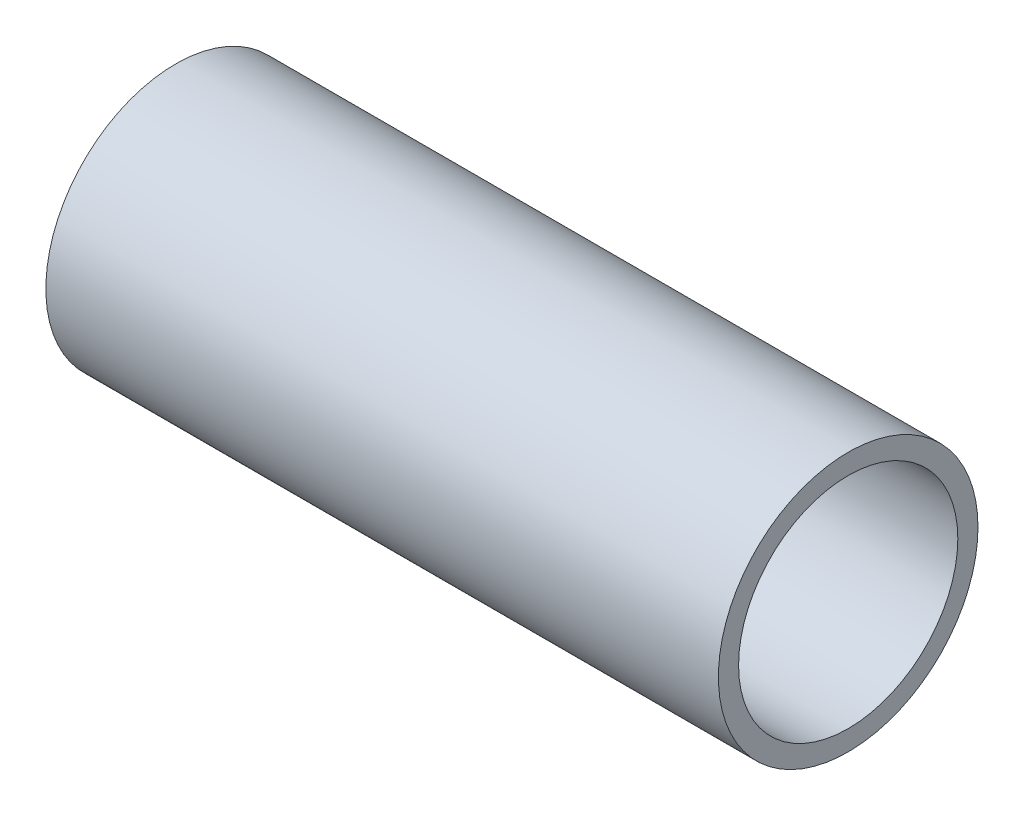
ISO-10303-21;
HEADER;
FILE_DESCRIPTION(('STEP AP214'),'2;1');
FILE_NAME('part.step','',(''),(''),'','','');
FILE_SCHEMA(('AUTOMOTIVE_DESIGN { 1 0 10303 214 1 1 1 1 }'));
ENDSEC;
DATA;
#1=APPLICATION_CONTEXT('core data for automotive mechanical design processes');
#2=APPLICATION_PROTOCOL_DEFINITION('international standard','automotive_design',2000,#1);
#3=PRODUCT_CONTEXT('',#1,'mechanical');
#4=PRODUCT('Part','Part','',(#3));
#5=PRODUCT_RELATED_PRODUCT_CATEGORY('part','',(#4));
#6=PRODUCT_DEFINITION_FORMATION('','',#4);
#7=PRODUCT_DEFINITION_CONTEXT('part definition',#1,'design');
#8=PRODUCT_DEFINITION('design','',#6,#7);
#9=PRODUCT_DEFINITION_SHAPE('','',#8);
#10=(LENGTH_UNIT() NAMED_UNIT(*) SI_UNIT(.MILLI.,.METRE.));
#11=(NAMED_UNIT(*) PLANE_ANGLE_UNIT() SI_UNIT($,.RADIAN.));
#12=(NAMED_UNIT(*) SI_UNIT($,.STERADIAN.) SOLID_ANGLE_UNIT());
#13=UNCERTAINTY_MEASURE_WITH_UNIT(LENGTH_MEASURE(1.E-05),#10,'distance_accuracy_value','');
#14=(GEOMETRIC_REPRESENTATION_CONTEXT(3) GLOBAL_UNCERTAINTY_ASSIGNED_CONTEXT((#13)) GLOBAL_UNIT_ASSIGNED_CONTEXT((#10,
#11,#12)) REPRESENTATION_CONTEXT('',''));
#15=CARTESIAN_POINT('',(0.,0.,0.));
#16=DIRECTION('',(0.,0.,1.));
#17=DIRECTION('',(1.,0.,0.));
#18=AXIS2_PLACEMENT_3D('',#15,#16,#17);
#19=CARTESIAN_POINT('',(-50.,0.,0.));
#20=DIRECTION('',(1.,0.,0.));
#21=DIRECTION('',(0.,0.,-1.));
#22=AXIS2_PLACEMENT_3D('',#19,#20,#21);
#23=CYLINDRICAL_SURFACE('',#22,9.65);
#24=CARTESIAN_POINT('',(-50.,0.,0.));
#25=DIRECTION('',(1.,0.,0.));
#26=DIRECTION('',(0.,0.,-1.));
#27=AXIS2_PLACEMENT_3D('',#24,#25,#26);
#28=CIRCLE('',#27,9.65);
#29=CARTESIAN_POINT('',(-50.,0.,-9.65));
#30=VERTEX_POINT('',#29);
#31=EDGE_CURVE('E10',#30,#30,#28,.T.);
#32=ORIENTED_EDGE('',*,*,#31,.T.);
#33=EDGE_LOOP('',(#32));
#34=FACE_BOUND('',#33,.T.);
#35=CARTESIAN_POINT('',(0.,0.,0.));
#36=DIRECTION('',(1.,0.,0.));
#37=DIRECTION('',(0.,0.,-1.));
#38=AXIS2_PLACEMENT_3D('',#35,#36,#37);
#39=CIRCLE('',#38,9.65);
#40=CARTESIAN_POINT('',(0.,0.,-9.65));
#41=VERTEX_POINT('',#40);
#42=EDGE_CURVE('E38',#41,#41,#39,.T.);
#43=ORIENTED_EDGE('',*,*,#42,.F.);
#44=EDGE_LOOP('',(#43));
#45=FACE_BOUND('',#44,.T.);
#46=ADVANCED_FACE('F35',(#34,#45),#23,.T.);
#47=CARTESIAN_POINT('',(-50.,0.,0.));
#48=DIRECTION('',(1.,0.,0.));
#49=DIRECTION('',(0.,0.,-1.));
#50=AXIS2_PLACEMENT_3D('',#47,#48,#49);
#51=PLANE('',#50);
#52=CARTESIAN_POINT('',(-50.,0.,0.));
#53=DIRECTION('',(1.,0.,0.));
#54=DIRECTION('',(0.,0.,-1.));
#55=AXIS2_PLACEMENT_3D('',#52,#53,#54);
#56=CIRCLE('',#55,8.15);
#57=CARTESIAN_POINT('',(-50.,0.,-8.15));
#58=VERTEX_POINT('',#57);
#59=EDGE_CURVE('E45',#58,#58,#56,.T.);
#60=ORIENTED_EDGE('',*,*,#59,.T.);
#61=EDGE_LOOP('',(#60));
#62=FACE_BOUND('',#61,.T.);
#63=ORIENTED_EDGE('',*,*,#31,.F.);
#64=EDGE_LOOP('',(#63));
#65=FACE_BOUND('',#64,.T.);
#66=ADVANCED_FACE('F53',(#62,#65),#51,.F.);
#67=CARTESIAN_POINT('',(0.,0.,0.));
#68=DIRECTION('',(1.,0.,0.));
#69=DIRECTION('',(0.,0.,-1.));
#70=AXIS2_PLACEMENT_3D('',#67,#68,#69);
#71=PLANE('',#70);
#72=CARTESIAN_POINT('',(0.,0.,0.));
#73=DIRECTION('',(1.,0.,0.));
#74=DIRECTION('',(0.,0.,-1.));
#75=AXIS2_PLACEMENT_3D('',#72,#73,#74);
#76=CIRCLE('',#75,8.15);
#77=CARTESIAN_POINT('',(0.,0.,-8.15));
#78=VERTEX_POINT('',#77);
#79=EDGE_CURVE('E47',#78,#78,#76,.T.);
#80=ORIENTED_EDGE('',*,*,#79,.F.);
#81=EDGE_LOOP('',(#80));
#82=FACE_BOUND('',#81,.T.);
#83=ORIENTED_EDGE('',*,*,#42,.T.);
#84=EDGE_LOOP('',(#83));
#85=FACE_BOUND('',#84,.T.);
#86=ADVANCED_FACE('F59',(#82,#85),#71,.T.);
#87=CARTESIAN_POINT('',(-50.,0.,0.));
#88=DIRECTION('',(1.,0.,0.));
#89=DIRECTION('',(0.,0.,-1.));
#90=AXIS2_PLACEMENT_3D('',#87,#88,#89);
#91=CYLINDRICAL_SURFACE('',#90,8.15);
#92=ORIENTED_EDGE('',*,*,#59,.F.);
#93=EDGE_LOOP('',(#92));
#94=FACE_BOUND('',#93,.T.);
#95=ORIENTED_EDGE('',*,*,#79,.T.);
#96=EDGE_LOOP('',(#95));
#97=FACE_BOUND('',#96,.T.);
#98=ADVANCED_FACE('F56',(#94,#97),#91,.F.);
#99=CLOSED_SHELL('',(#46,#66,#86,#98));
#100=MANIFOLD_SOLID_BREP('B2',#99);
#101=ADVANCED_BREP_SHAPE_REPRESENTATION('',(#18,#100),#14);
#102=SHAPE_DEFINITION_REPRESENTATION(#9,#101);
ENDSEC;
END-ISO-10303-21;
